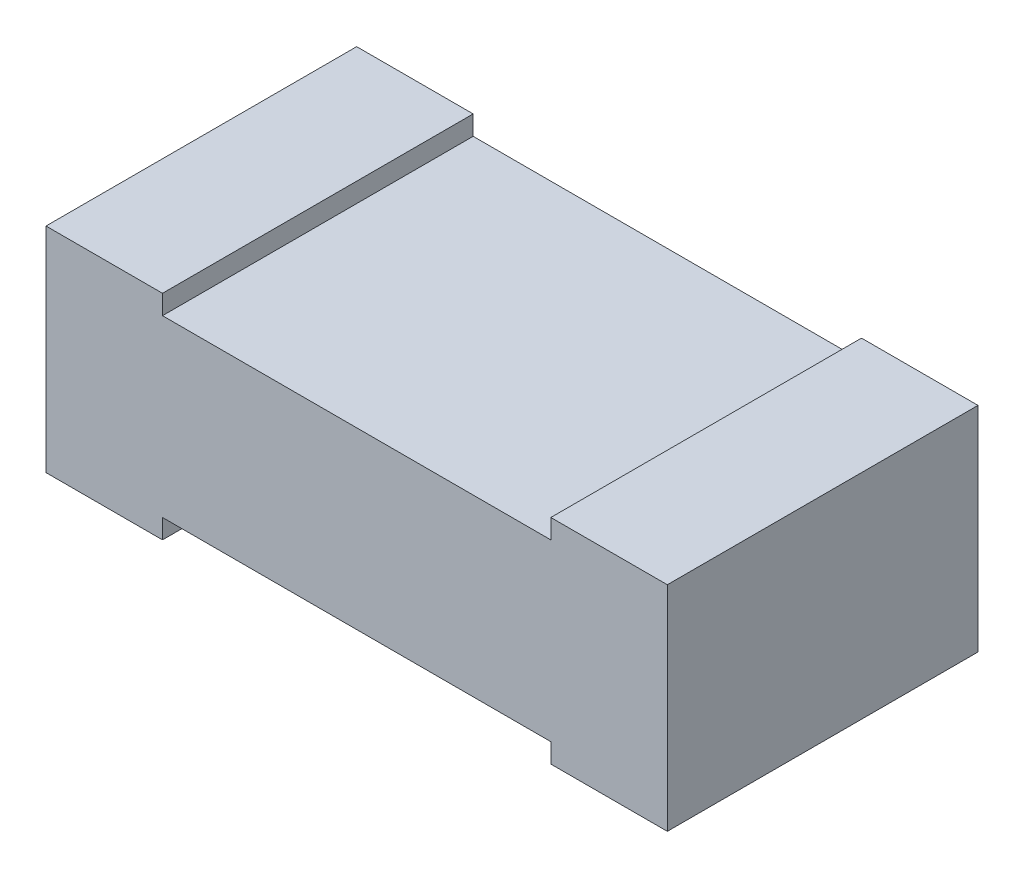
ISO-10303-21;
HEADER;
FILE_DESCRIPTION(('STEP AP214'),'2;1');
FILE_NAME('part.step','',(''),(''),'','','');
FILE_SCHEMA(('AUTOMOTIVE_DESIGN { 1 0 10303 214 1 1 1 1 }'));
ENDSEC;
DATA;
#1=APPLICATION_CONTEXT('core data for automotive mechanical design processes');
#2=APPLICATION_PROTOCOL_DEFINITION('international standard','automotive_design',2000,#1);
#3=PRODUCT_CONTEXT('',#1,'mechanical');
#4=PRODUCT('Part','Part','',(#3));
#5=PRODUCT_RELATED_PRODUCT_CATEGORY('part','',(#4));
#6=PRODUCT_DEFINITION_FORMATION('','',#4);
#7=PRODUCT_DEFINITION_CONTEXT('part definition',#1,'design');
#8=PRODUCT_DEFINITION('design','',#6,#7);
#9=PRODUCT_DEFINITION_SHAPE('','',#8);
#10=(LENGTH_UNIT() NAMED_UNIT(*) SI_UNIT(.MILLI.,.METRE.));
#11=(NAMED_UNIT(*) PLANE_ANGLE_UNIT() SI_UNIT($,.RADIAN.));
#12=(NAMED_UNIT(*) SI_UNIT($,.STERADIAN.) SOLID_ANGLE_UNIT());
#13=UNCERTAINTY_MEASURE_WITH_UNIT(LENGTH_MEASURE(1.E-05),#10,'distance_accuracy_value','');
#14=(GEOMETRIC_REPRESENTATION_CONTEXT(3) GLOBAL_UNCERTAINTY_ASSIGNED_CONTEXT((#13)) GLOBAL_UNIT_ASSIGNED_CONTEXT((#10,
#11,#12)) REPRESENTATION_CONTEXT('',''));
#15=CARTESIAN_POINT('',(0.,0.,0.));
#16=DIRECTION('',(0.,0.,1.));
#17=DIRECTION('',(1.,0.,0.));
#18=AXIS2_PLACEMENT_3D('',#15,#16,#17);
#19=CARTESIAN_POINT('',(0.8,0.55,-0.4));
#20=DIRECTION('',(-1.,0.,0.));
#21=DIRECTION('',(0.,0.,1.));
#22=AXIS2_PLACEMENT_3D('',#19,#20,#21);
#23=PLANE('',#22);
#24=DIRECTION('',(0.,1.,0.));
#25=VECTOR('',#24,1.);
#26=CARTESIAN_POINT('',(0.8,0.55,-0.4));
#27=LINE('',#26,#25);
#28=CARTESIAN_POINT('',(0.8,0.,-0.4));
#29=VERTEX_POINT('',#28);
#30=CARTESIAN_POINT('',(0.8,0.55,-0.4));
#31=VERTEX_POINT('',#30);
#32=EDGE_CURVE('E106',#29,#31,#27,.T.);
#33=ORIENTED_EDGE('',*,*,#32,.T.);
#34=DIRECTION('',(0.,0.,1.));
#35=VECTOR('',#34,1.);
#36=CARTESIAN_POINT('',(0.8,0.55,0.4));
#37=LINE('',#36,#35);
#38=CARTESIAN_POINT('',(0.8,0.55,0.4));
#39=VERTEX_POINT('',#38);
#40=EDGE_CURVE('E108',#39,#31,#37,.F.);
#41=ORIENTED_EDGE('',*,*,#40,.F.);
#42=DIRECTION('',(0.,1.,0.));
#43=VECTOR('',#42,1.);
#44=CARTESIAN_POINT('',(0.8,0.55,0.4));
#45=LINE('',#44,#43);
#46=CARTESIAN_POINT('',(0.8,0.,0.4));
#47=VERTEX_POINT('',#46);
#48=EDGE_CURVE('E200',#39,#47,#45,.F.);
#49=ORIENTED_EDGE('',*,*,#48,.T.);
#50=DIRECTION('',(0.,0.,1.));
#51=VECTOR('',#50,1.);
#52=CARTESIAN_POINT('',(0.8,0.,0.4));
#53=LINE('',#52,#51);
#54=EDGE_CURVE('E20',#47,#29,#53,.F.);
#55=ORIENTED_EDGE('',*,*,#54,.T.);
#56=EDGE_LOOP('',(#33,#41,#49,#55));
#57=FACE_BOUND('',#56,.T.);
#58=ADVANCED_FACE('F17',(#57),#23,.F.);
#59=CARTESIAN_POINT('',(-0.8,0.,0.4));
#60=DIRECTION('',(0.,1.,0.));
#61=DIRECTION('',(0.,0.,1.));
#62=AXIS2_PLACEMENT_3D('',#59,#60,#61);
#63=PLANE('',#62);
#64=DIRECTION('',(0.,0.,-1.));
#65=VECTOR('',#64,1.);
#66=CARTESIAN_POINT('',(0.5,0.,-0.4));
#67=LINE('',#66,#65);
#68=CARTESIAN_POINT('',(0.5,0.,0.4));
#69=VERTEX_POINT('',#68);
#70=CARTESIAN_POINT('',(0.5,0.,-0.4));
#71=VERTEX_POINT('',#70);
#72=EDGE_CURVE('E144',#69,#71,#67,.T.);
#73=ORIENTED_EDGE('',*,*,#72,.T.);
#74=DIRECTION('',(1.,0.,0.));
#75=VECTOR('',#74,1.);
#76=CARTESIAN_POINT('',(-0.8,0.,-0.4));
#77=LINE('',#76,#75);
#78=EDGE_CURVE('E149',#71,#29,#77,.T.);
#79=ORIENTED_EDGE('',*,*,#78,.T.);
#80=ORIENTED_EDGE('',*,*,#54,.F.);
#81=DIRECTION('',(-1.,0.,0.));
#82=VECTOR('',#81,1.);
#83=CARTESIAN_POINT('',(-0.8,0.,0.4));
#84=LINE('',#83,#82);
#85=EDGE_CURVE('E151',#47,#69,#84,.T.);
#86=ORIENTED_EDGE('',*,*,#85,.T.);
#87=EDGE_LOOP('',(#73,#79,#80,#86));
#88=FACE_BOUND('',#87,.T.);
#89=ADVANCED_FACE('F148',(#88),#63,.F.);
#90=CARTESIAN_POINT('',(0.5,0.,-0.4));
#91=DIRECTION('',(1.,0.,0.));
#92=DIRECTION('',(0.,0.,-1.));
#93=AXIS2_PLACEMENT_3D('',#90,#91,#92);
#94=PLANE('',#93);
#95=DIRECTION('',(0.,1.,0.));
#96=VECTOR('',#95,1.);
#97=CARTESIAN_POINT('',(0.5,0.55,-0.4));
#98=LINE('',#97,#96);
#99=CARTESIAN_POINT('',(0.5,0.05,-0.4));
#100=VERTEX_POINT('',#99);
#101=EDGE_CURVE('E154',#100,#71,#98,.F.);
#102=ORIENTED_EDGE('',*,*,#101,.T.);
#103=ORIENTED_EDGE('',*,*,#72,.F.);
#104=DIRECTION('',(0.,1.,0.));
#105=VECTOR('',#104,1.);
#106=CARTESIAN_POINT('',(0.5,0.55,0.4));
#107=LINE('',#106,#105);
#108=CARTESIAN_POINT('',(0.5,0.05,0.4));
#109=VERTEX_POINT('',#108);
#110=EDGE_CURVE('E197',#69,#109,#107,.T.);
#111=ORIENTED_EDGE('',*,*,#110,.T.);
#112=DIRECTION('',(0.,0.,1.));
#113=VECTOR('',#112,1.);
#114=CARTESIAN_POINT('',(0.5,0.05,-1.49658560997307));
#115=LINE('',#114,#113);
#116=EDGE_CURVE('E142',#100,#109,#115,.T.);
#117=ORIENTED_EDGE('',*,*,#116,.F.);
#118=EDGE_LOOP('',(#102,#103,#111,#117));
#119=FACE_BOUND('',#118,.T.);
#120=ADVANCED_FACE('F155',(#119),#94,.F.);
#121=CARTESIAN_POINT('',(-0.5,0.05,-1.49658560997307));
#122=DIRECTION('',(0.,-1.,0.));
#123=DIRECTION('',(1.,0.,0.));
#124=AXIS2_PLACEMENT_3D('',#121,#122,#123);
#125=PLANE('',#124);
#126=DIRECTION('',(-1.,0.,0.));
#127=VECTOR('',#126,1.);
#128=CARTESIAN_POINT('',(-0.8,0.05,0.4));
#129=LINE('',#128,#127);
#130=CARTESIAN_POINT('',(-0.5,0.05,0.4));
#131=VERTEX_POINT('',#130);
#132=EDGE_CURVE('E192',#109,#131,#129,.T.);
#133=ORIENTED_EDGE('',*,*,#132,.T.);
#134=DIRECTION('',(0.,0.,1.));
#135=VECTOR('',#134,1.);
#136=CARTESIAN_POINT('',(-0.5,0.05,-0.4));
#137=LINE('',#136,#135);
#138=CARTESIAN_POINT('',(-0.5,0.05,-0.4));
#139=VERTEX_POINT('',#138);
#140=EDGE_CURVE('E140',#131,#139,#137,.F.);
#141=ORIENTED_EDGE('',*,*,#140,.T.);
#142=DIRECTION('',(1.,0.,0.));
#143=VECTOR('',#142,1.);
#144=CARTESIAN_POINT('',(-0.8,0.05,-0.4));
#145=LINE('',#144,#143);
#146=EDGE_CURVE('E158',#139,#100,#145,.T.);
#147=ORIENTED_EDGE('',*,*,#146,.T.);
#148=ORIENTED_EDGE('',*,*,#116,.T.);
#149=EDGE_LOOP('',(#133,#141,#147,#148));
#150=FACE_BOUND('',#149,.T.);
#151=ADVANCED_FACE('F313',(#150),#125,.T.);
#152=CARTESIAN_POINT('',(-0.5,0.,-0.4));
#153=DIRECTION('',(-1.,0.,0.));
#154=DIRECTION('',(0.,0.,1.));
#155=AXIS2_PLACEMENT_3D('',#152,#153,#154);
#156=PLANE('',#155);
#157=ORIENTED_EDGE('',*,*,#140,.F.);
#158=DIRECTION('',(0.,1.,0.));
#159=VECTOR('',#158,1.);
#160=CARTESIAN_POINT('',(-0.5,0.55,0.4));
#161=LINE('',#160,#159);
#162=CARTESIAN_POINT('',(-0.5,0.,0.4));
#163=VERTEX_POINT('',#162);
#164=EDGE_CURVE('E188',#131,#163,#161,.F.);
#165=ORIENTED_EDGE('',*,*,#164,.T.);
#166=DIRECTION('',(0.,0.,1.));
#167=VECTOR('',#166,1.);
#168=CARTESIAN_POINT('',(-0.5,0.,0.4));
#169=LINE('',#168,#167);
#170=CARTESIAN_POINT('',(-0.5,0.,-0.4));
#171=VERTEX_POINT('',#170);
#172=EDGE_CURVE('E138',#163,#171,#169,.F.);
#173=ORIENTED_EDGE('',*,*,#172,.T.);
#174=DIRECTION('',(0.,1.,0.));
#175=VECTOR('',#174,1.);
#176=CARTESIAN_POINT('',(-0.5,0.55,-0.4));
#177=LINE('',#176,#175);
#178=EDGE_CURVE('E167',#171,#139,#177,.T.);
#179=ORIENTED_EDGE('',*,*,#178,.T.);
#180=EDGE_LOOP('',(#157,#165,#173,#179));
#181=FACE_BOUND('',#180,.T.);
#182=ADVANCED_FACE('F304',(#181),#156,.F.);
#183=CARTESIAN_POINT('',(-0.8,0.,0.4));
#184=DIRECTION('',(0.,1.,0.));
#185=DIRECTION('',(0.,0.,1.));
#186=AXIS2_PLACEMENT_3D('',#183,#184,#185);
#187=PLANE('',#186);
#188=ORIENTED_EDGE('',*,*,#172,.F.);
#189=DIRECTION('',(-1.,0.,0.));
#190=VECTOR('',#189,1.);
#191=CARTESIAN_POINT('',(-0.8,0.,0.4));
#192=LINE('',#191,#190);
#193=CARTESIAN_POINT('',(-0.8,0.,0.4));
#194=VERTEX_POINT('',#193);
#195=EDGE_CURVE('E185',#163,#194,#192,.T.);
#196=ORIENTED_EDGE('',*,*,#195,.T.);
#197=DIRECTION('',(0.,0.,-1.));
#198=VECTOR('',#197,1.);
#199=CARTESIAN_POINT('',(-0.8,0.,-0.4));
#200=LINE('',#199,#198);
#201=CARTESIAN_POINT('',(-0.8,0.,-0.4));
#202=VERTEX_POINT('',#201);
#203=EDGE_CURVE('E136',#194,#202,#200,.T.);
#204=ORIENTED_EDGE('',*,*,#203,.T.);
#205=DIRECTION('',(1.,0.,0.));
#206=VECTOR('',#205,1.);
#207=CARTESIAN_POINT('',(-0.8,0.,-0.4));
#208=LINE('',#207,#206);
#209=EDGE_CURVE('E170',#202,#171,#208,.T.);
#210=ORIENTED_EDGE('',*,*,#209,.T.);
#211=EDGE_LOOP('',(#188,#196,#204,#210));
#212=FACE_BOUND('',#211,.T.);
#213=ADVANCED_FACE('F183',(#212),#187,.F.);
#214=CARTESIAN_POINT('',(-0.8,0.55,-0.4));
#215=DIRECTION('',(1.,0.,0.));
#216=DIRECTION('',(0.,0.,-1.));
#217=AXIS2_PLACEMENT_3D('',#214,#215,#216);
#218=PLANE('',#217);
#219=DIRECTION('',(0.,1.,0.));
#220=VECTOR('',#219,1.);
#221=CARTESIAN_POINT('',(-0.8,0.55,0.4));
#222=LINE('',#221,#220);
#223=CARTESIAN_POINT('',(-0.8,0.55,0.4));
#224=VERTEX_POINT('',#223);
#225=EDGE_CURVE('E187',#194,#224,#222,.T.);
#226=ORIENTED_EDGE('',*,*,#225,.T.);
#227=DIRECTION('',(0.,0.,1.));
#228=VECTOR('',#227,1.);
#229=CARTESIAN_POINT('',(-0.8,0.55,0.4));
#230=LINE('',#229,#228);
#231=CARTESIAN_POINT('',(-0.8,0.55,-0.4));
#232=VERTEX_POINT('',#231);
#233=EDGE_CURVE('E120',#232,#224,#230,.T.);
#234=ORIENTED_EDGE('',*,*,#233,.F.);
#235=DIRECTION('',(0.,1.,0.));
#236=VECTOR('',#235,1.);
#237=CARTESIAN_POINT('',(-0.8,0.55,-0.4));
#238=LINE('',#237,#236);
#239=EDGE_CURVE('E130',#232,#202,#238,.F.);
#240=ORIENTED_EDGE('',*,*,#239,.T.);
#241=ORIENTED_EDGE('',*,*,#203,.F.);
#242=EDGE_LOOP('',(#226,#234,#240,#241));
#243=FACE_BOUND('',#242,.T.);
#244=ADVANCED_FACE('F177',(#243),#218,.F.);
#245=CARTESIAN_POINT('',(-0.8,0.55,0.4));
#246=DIRECTION('',(0.,1.,0.));
#247=DIRECTION('',(0.,0.,1.));
#248=AXIS2_PLACEMENT_3D('',#245,#246,#247);
#249=PLANE('',#248);
#250=ORIENTED_EDGE('',*,*,#233,.T.);
#251=DIRECTION('',(-1.,0.,0.));
#252=VECTOR('',#251,1.);
#253=CARTESIAN_POINT('',(-0.8,0.55,0.4));
#254=LINE('',#253,#252);
#255=CARTESIAN_POINT('',(-0.5,0.55,0.4));
#256=VERTEX_POINT('',#255);
#257=EDGE_CURVE('E190',#224,#256,#254,.F.);
#258=ORIENTED_EDGE('',*,*,#257,.T.);
#259=DIRECTION('',(0.,0.,1.));
#260=VECTOR('',#259,1.);
#261=CARTESIAN_POINT('',(-0.5,0.55,-0.4));
#262=LINE('',#261,#260);
#263=CARTESIAN_POINT('',(-0.5,0.55,-0.4));
#264=VERTEX_POINT('',#263);
#265=EDGE_CURVE('E160',#256,#264,#262,.F.);
#266=ORIENTED_EDGE('',*,*,#265,.T.);
#267=DIRECTION('',(1.,0.,0.));
#268=VECTOR('',#267,1.);
#269=CARTESIAN_POINT('',(-0.8,0.55,-0.4));
#270=LINE('',#269,#268);
#271=EDGE_CURVE('E127',#264,#232,#270,.F.);
#272=ORIENTED_EDGE('',*,*,#271,.T.);
#273=EDGE_LOOP('',(#250,#258,#266,#272));
#274=FACE_BOUND('',#273,.T.);
#275=ADVANCED_FACE('F226',(#274),#249,.T.);
#276=CARTESIAN_POINT('',(-0.8,0.55,0.4));
#277=DIRECTION('',(0.,1.,0.));
#278=DIRECTION('',(0.,0.,1.));
#279=AXIS2_PLACEMENT_3D('',#276,#277,#278);
#280=PLANE('',#279);
#281=ORIENTED_EDGE('',*,*,#40,.T.);
#282=DIRECTION('',(1.,0.,0.));
#283=VECTOR('',#282,1.);
#284=CARTESIAN_POINT('',(-0.8,0.55,-0.4));
#285=LINE('',#284,#283);
#286=CARTESIAN_POINT('',(0.5,0.55,-0.4));
#287=VERTEX_POINT('',#286);
#288=EDGE_CURVE('E113',#31,#287,#285,.F.);
#289=ORIENTED_EDGE('',*,*,#288,.T.);
#290=DIRECTION('',(0.,0.,-1.));
#291=VECTOR('',#290,1.);
#292=CARTESIAN_POINT('',(0.5,0.55,-0.4));
#293=LINE('',#292,#291);
#294=CARTESIAN_POINT('',(0.5,0.55,0.4));
#295=VERTEX_POINT('',#294);
#296=EDGE_CURVE('E221',#287,#295,#293,.F.);
#297=ORIENTED_EDGE('',*,*,#296,.T.);
#298=DIRECTION('',(-1.,0.,0.));
#299=VECTOR('',#298,1.);
#300=CARTESIAN_POINT('',(-0.8,0.55,0.4));
#301=LINE('',#300,#299);
#302=EDGE_CURVE('E118',#295,#39,#301,.F.);
#303=ORIENTED_EDGE('',*,*,#302,.T.);
#304=EDGE_LOOP('',(#281,#289,#297,#303));
#305=FACE_BOUND('',#304,.T.);
#306=ADVANCED_FACE('F116',(#305),#280,.T.);
#307=CARTESIAN_POINT('',(-0.8,0.55,-0.4));
#308=DIRECTION('',(0.,0.,1.));
#309=DIRECTION('',(1.,0.,0.));
#310=AXIS2_PLACEMENT_3D('',#307,#308,#309);
#311=PLANE('',#310);
#312=ORIENTED_EDGE('',*,*,#101,.F.);
#313=ORIENTED_EDGE('',*,*,#146,.F.);
#314=ORIENTED_EDGE('',*,*,#178,.F.);
#315=ORIENTED_EDGE('',*,*,#209,.F.);
#316=ORIENTED_EDGE('',*,*,#239,.F.);
#317=ORIENTED_EDGE('',*,*,#271,.F.);
#318=DIRECTION('',(0.,1.,0.));
#319=VECTOR('',#318,1.);
#320=CARTESIAN_POINT('',(-0.5,0.,-0.4));
#321=LINE('',#320,#319);
#322=CARTESIAN_POINT('',(-0.5,0.5,-0.4));
#323=VERTEX_POINT('',#322);
#324=EDGE_CURVE('E162',#264,#323,#321,.F.);
#325=ORIENTED_EDGE('',*,*,#324,.T.);
#326=DIRECTION('',(1.,0.,0.));
#327=VECTOR('',#326,1.);
#328=CARTESIAN_POINT('',(-0.5,0.5,-0.4));
#329=LINE('',#328,#327);
#330=CARTESIAN_POINT('',(0.5,0.5,-0.4));
#331=VERTEX_POINT('',#330);
#332=EDGE_CURVE('E204',#331,#323,#329,.F.);
#333=ORIENTED_EDGE('',*,*,#332,.F.);
#334=DIRECTION('',(0.,1.,0.));
#335=VECTOR('',#334,1.);
#336=CARTESIAN_POINT('',(0.5,0.,-0.4));
#337=LINE('',#336,#335);
#338=EDGE_CURVE('E125',#331,#287,#337,.T.);
#339=ORIENTED_EDGE('',*,*,#338,.T.);
#340=ORIENTED_EDGE('',*,*,#288,.F.);
#341=ORIENTED_EDGE('',*,*,#32,.F.);
#342=ORIENTED_EDGE('',*,*,#78,.F.);
#343=EDGE_LOOP('',(#312,#313,#314,#315,#316,#317,#325,#333,#339,#340,#341,#342));
#344=FACE_BOUND('',#343,.T.);
#345=ADVANCED_FACE('F123',(#344),#311,.F.);
#346=CARTESIAN_POINT('',(-0.5,0.,-0.4));
#347=DIRECTION('',(-1.,0.,0.));
#348=DIRECTION('',(0.,0.,1.));
#349=AXIS2_PLACEMENT_3D('',#346,#347,#348);
#350=PLANE('',#349);
#351=ORIENTED_EDGE('',*,*,#324,.F.);
#352=ORIENTED_EDGE('',*,*,#265,.F.);
#353=DIRECTION('',(0.,1.,0.));
#354=VECTOR('',#353,1.);
#355=CARTESIAN_POINT('',(-0.5,0.55,0.4));
#356=LINE('',#355,#354);
#357=CARTESIAN_POINT('',(-0.5,0.5,0.4));
#358=VERTEX_POINT('',#357);
#359=EDGE_CURVE('E211',#256,#358,#356,.F.);
#360=ORIENTED_EDGE('',*,*,#359,.T.);
#361=DIRECTION('',(0.,0.,1.));
#362=VECTOR('',#361,1.);
#363=CARTESIAN_POINT('',(-0.5,0.5,-1.49658560997307));
#364=LINE('',#363,#362);
#365=EDGE_CURVE('E208',#323,#358,#364,.T.);
#366=ORIENTED_EDGE('',*,*,#365,.F.);
#367=EDGE_LOOP('',(#351,#352,#360,#366));
#368=FACE_BOUND('',#367,.T.);
#369=ADVANCED_FACE('F209',(#368),#350,.F.);
#370=CARTESIAN_POINT('',(-0.8,0.55,0.4));
#371=DIRECTION('',(0.,0.,-1.));
#372=DIRECTION('',(-1.,0.,0.));
#373=AXIS2_PLACEMENT_3D('',#370,#371,#372);
#374=PLANE('',#373);
#375=DIRECTION('',(0.,1.,0.));
#376=VECTOR('',#375,1.);
#377=CARTESIAN_POINT('',(0.5,0.,0.4));
#378=LINE('',#377,#376);
#379=CARTESIAN_POINT('',(0.5,0.5,0.4));
#380=VERTEX_POINT('',#379);
#381=EDGE_CURVE('E35',#295,#380,#378,.F.);
#382=ORIENTED_EDGE('',*,*,#381,.T.);
#383=DIRECTION('',(1.,0.,0.));
#384=VECTOR('',#383,1.);
#385=CARTESIAN_POINT('',(-0.5,0.5,0.4));
#386=LINE('',#385,#384);
#387=EDGE_CURVE('E26',#358,#380,#386,.T.);
#388=ORIENTED_EDGE('',*,*,#387,.F.);
#389=ORIENTED_EDGE('',*,*,#359,.F.);
#390=ORIENTED_EDGE('',*,*,#257,.F.);
#391=ORIENTED_EDGE('',*,*,#225,.F.);
#392=ORIENTED_EDGE('',*,*,#195,.F.);
#393=ORIENTED_EDGE('',*,*,#164,.F.);
#394=ORIENTED_EDGE('',*,*,#132,.F.);
#395=ORIENTED_EDGE('',*,*,#110,.F.);
#396=ORIENTED_EDGE('',*,*,#85,.F.);
#397=ORIENTED_EDGE('',*,*,#48,.F.);
#398=ORIENTED_EDGE('',*,*,#302,.F.);
#399=EDGE_LOOP('',(#382,#388,#389,#390,#391,#392,#393,#394,#395,#396,#397,#398));
#400=FACE_BOUND('',#399,.T.);
#401=ADVANCED_FACE('F227',(#400),#374,.F.);
#402=CARTESIAN_POINT('',(0.5,0.,-0.4));
#403=DIRECTION('',(1.,0.,0.));
#404=DIRECTION('',(0.,0.,-1.));
#405=AXIS2_PLACEMENT_3D('',#402,#403,#404);
#406=PLANE('',#405);
#407=DIRECTION('',(0.,0.,1.));
#408=VECTOR('',#407,1.);
#409=CARTESIAN_POINT('',(0.5,0.5,-1.49658560997307));
#410=LINE('',#409,#408);
#411=EDGE_CURVE('E11',#380,#331,#410,.F.);
#412=ORIENTED_EDGE('',*,*,#411,.F.);
#413=ORIENTED_EDGE('',*,*,#381,.F.);
#414=ORIENTED_EDGE('',*,*,#296,.F.);
#415=ORIENTED_EDGE('',*,*,#338,.F.);
#416=EDGE_LOOP('',(#412,#413,#414,#415));
#417=FACE_BOUND('',#416,.T.);
#418=ADVANCED_FACE('F229',(#417),#406,.F.);
#419=CARTESIAN_POINT('',(-0.5,0.5,-1.49658560997307));
#420=DIRECTION('',(0.,1.,0.));
#421=DIRECTION('',(0.,0.,1.));
#422=AXIS2_PLACEMENT_3D('',#419,#420,#421);
#423=PLANE('',#422);
#424=ORIENTED_EDGE('',*,*,#387,.T.);
#425=ORIENTED_EDGE('',*,*,#411,.T.);
#426=ORIENTED_EDGE('',*,*,#332,.T.);
#427=ORIENTED_EDGE('',*,*,#365,.T.);
#428=EDGE_LOOP('',(#424,#425,#426,#427));
#429=FACE_BOUND('',#428,.T.);
#430=ADVANCED_FACE('F215',(#429),#423,.T.);
#431=CLOSED_SHELL('',(#58,#89,#120,#151,#182,#213,#244,#275,#306,#345,#369,#401,#418,#430));
#432=MANIFOLD_SOLID_BREP('B1',#431);
#433=ADVANCED_BREP_SHAPE_REPRESENTATION('',(#18,#432),#14);
#434=SHAPE_DEFINITION_REPRESENTATION(#9,#433);
ENDSEC;
END-ISO-10303-21;
